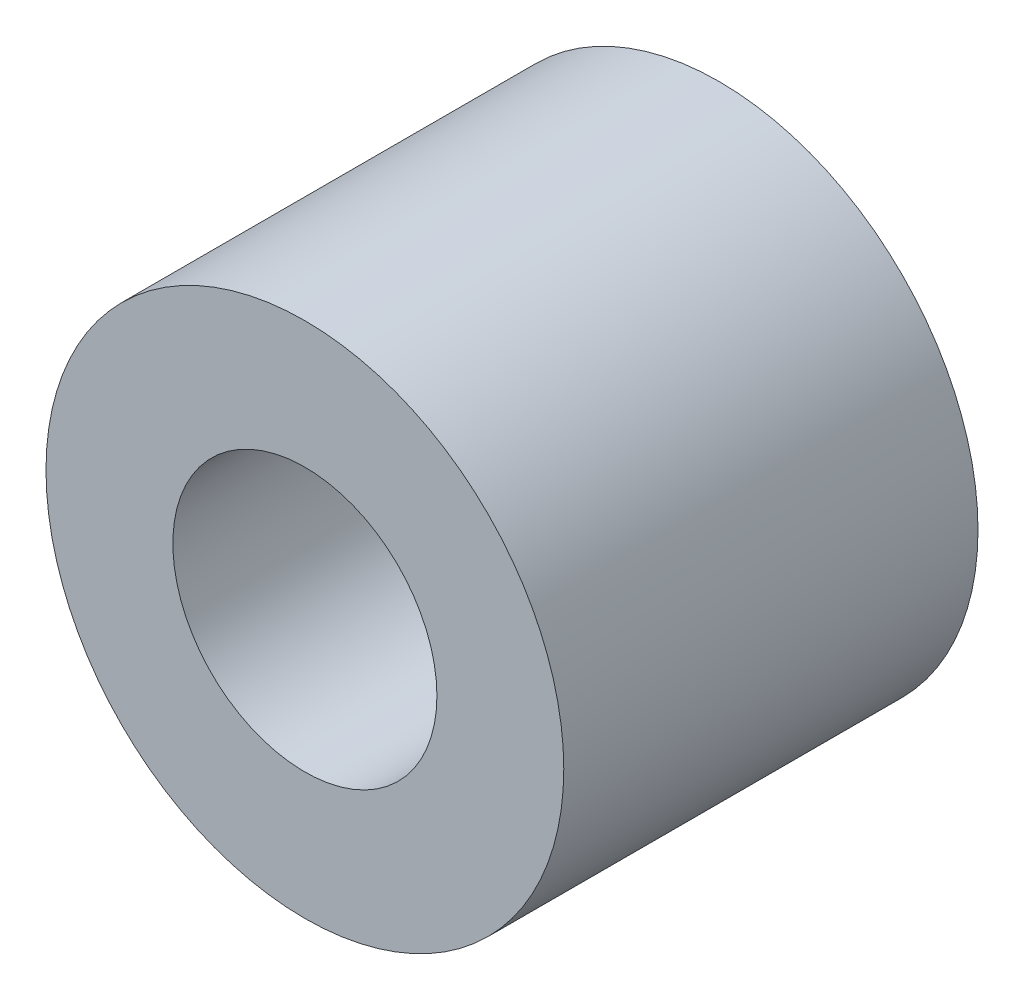
ISO-10303-21;
HEADER;
FILE_DESCRIPTION(('STEP AP214'),'2;1');
FILE_NAME('part.step','',(''),(''),'','','');
FILE_SCHEMA(('AUTOMOTIVE_DESIGN { 1 0 10303 214 1 1 1 1 }'));
ENDSEC;
DATA;
#1=APPLICATION_CONTEXT('core data for automotive mechanical design processes');
#2=APPLICATION_PROTOCOL_DEFINITION('international standard','automotive_design',2000,#1);
#3=PRODUCT_CONTEXT('',#1,'mechanical');
#4=PRODUCT('Part','Part','',(#3));
#5=PRODUCT_RELATED_PRODUCT_CATEGORY('part','',(#4));
#6=PRODUCT_DEFINITION_FORMATION('','',#4);
#7=PRODUCT_DEFINITION_CONTEXT('part definition',#1,'design');
#8=PRODUCT_DEFINITION('design','',#6,#7);
#9=PRODUCT_DEFINITION_SHAPE('','',#8);
#10=(LENGTH_UNIT() NAMED_UNIT(*) SI_UNIT(.MILLI.,.METRE.));
#11=(NAMED_UNIT(*) PLANE_ANGLE_UNIT() SI_UNIT($,.RADIAN.));
#12=(NAMED_UNIT(*) SI_UNIT($,.STERADIAN.) SOLID_ANGLE_UNIT());
#13=UNCERTAINTY_MEASURE_WITH_UNIT(LENGTH_MEASURE(1.E-05),#10,'distance_accuracy_value','');
#14=(GEOMETRIC_REPRESENTATION_CONTEXT(3) GLOBAL_UNCERTAINTY_ASSIGNED_CONTEXT((#13)) GLOBAL_UNIT_ASSIGNED_CONTEXT((#10,
#11,#12)) REPRESENTATION_CONTEXT('',''));
#15=CARTESIAN_POINT('',(0.,0.,0.));
#16=DIRECTION('',(0.,0.,1.));
#17=DIRECTION('',(1.,0.,0.));
#18=AXIS2_PLACEMENT_3D('',#15,#16,#17);
#19=CARTESIAN_POINT('',(-10.,0.,8.));
#20=DIRECTION('',(0.,0.,-1.));
#21=DIRECTION('',(-1.,0.,0.));
#22=AXIS2_PLACEMENT_3D('',#19,#20,#21);
#23=PLANE('',#22);
#24=CARTESIAN_POINT('',(0.,0.,8.));
#25=DIRECTION('',(0.,0.,1.));
#26=DIRECTION('',(1.,0.,0.));
#27=AXIS2_PLACEMENT_3D('',#24,#25,#26);
#28=CIRCLE('',#27,5.1);
#29=CARTESIAN_POINT('',(5.1,0.,8.));
#30=VERTEX_POINT('',#29);
#31=EDGE_CURVE('E51',#30,#30,#28,.T.);
#32=ORIENTED_EDGE('',*,*,#31,.F.);
#33=EDGE_LOOP('',(#32));
#34=FACE_BOUND('',#33,.T.);
#35=CARTESIAN_POINT('',(0.,0.,8.));
#36=DIRECTION('',(0.,0.,1.));
#37=DIRECTION('',(1.,0.,0.));
#38=AXIS2_PLACEMENT_3D('',#35,#36,#37);
#39=CIRCLE('',#38,10.);
#40=CARTESIAN_POINT('',(10.,0.,8.));
#41=VERTEX_POINT('',#40);
#42=EDGE_CURVE('E43',#41,#41,#39,.T.);
#43=ORIENTED_EDGE('',*,*,#42,.T.);
#44=EDGE_LOOP('',(#43));
#45=FACE_BOUND('',#44,.T.);
#46=ADVANCED_FACE('F37',(#34,#45),#23,.F.);
#47=CARTESIAN_POINT('',(-10.,0.,-8.));
#48=DIRECTION('',(0.,0.,1.));
#49=DIRECTION('',(1.,0.,0.));
#50=AXIS2_PLACEMENT_3D('',#47,#48,#49);
#51=PLANE('',#50);
#52=CARTESIAN_POINT('',(0.,0.,-8.));
#53=DIRECTION('',(0.,0.,1.));
#54=DIRECTION('',(1.,0.,0.));
#55=AXIS2_PLACEMENT_3D('',#52,#53,#54);
#56=CIRCLE('',#55,5.1);
#57=CARTESIAN_POINT('',(5.1,0.,-8.));
#58=VERTEX_POINT('',#57);
#59=EDGE_CURVE('E47',#58,#58,#56,.T.);
#60=ORIENTED_EDGE('',*,*,#59,.T.);
#61=EDGE_LOOP('',(#60));
#62=FACE_BOUND('',#61,.T.);
#63=CARTESIAN_POINT('',(0.,0.,-8.));
#64=DIRECTION('',(0.,0.,1.));
#65=DIRECTION('',(1.,0.,0.));
#66=AXIS2_PLACEMENT_3D('',#63,#64,#65);
#67=CIRCLE('',#66,10.);
#68=CARTESIAN_POINT('',(10.,0.,-8.));
#69=VERTEX_POINT('',#68);
#70=EDGE_CURVE('E10',#69,#69,#67,.T.);
#71=ORIENTED_EDGE('',*,*,#70,.F.);
#72=EDGE_LOOP('',(#71));
#73=FACE_BOUND('',#72,.T.);
#74=ADVANCED_FACE('F60',(#62,#73),#51,.F.);
#75=CARTESIAN_POINT('',(0.,0.,8.));
#76=DIRECTION('',(0.,0.,1.));
#77=DIRECTION('',(1.,0.,0.));
#78=AXIS2_PLACEMENT_3D('',#75,#76,#77);
#79=CYLINDRICAL_SURFACE('',#78,10.);
#80=ORIENTED_EDGE('',*,*,#42,.F.);
#81=EDGE_LOOP('',(#80));
#82=FACE_BOUND('',#81,.T.);
#83=ORIENTED_EDGE('',*,*,#70,.T.);
#84=EDGE_LOOP('',(#83));
#85=FACE_BOUND('',#84,.T.);
#86=ADVANCED_FACE('F65',(#82,#85),#79,.T.);
#87=CARTESIAN_POINT('',(0.,0.,-8.));
#88=DIRECTION('',(0.,0.,1.));
#89=DIRECTION('',(1.,0.,0.));
#90=AXIS2_PLACEMENT_3D('',#87,#88,#89);
#91=CYLINDRICAL_SURFACE('',#90,5.1);
#92=ORIENTED_EDGE('',*,*,#59,.F.);
#93=EDGE_LOOP('',(#92));
#94=FACE_BOUND('',#93,.T.);
#95=ORIENTED_EDGE('',*,*,#31,.T.);
#96=EDGE_LOOP('',(#95));
#97=FACE_BOUND('',#96,.T.);
#98=ADVANCED_FACE('F57',(#94,#97),#91,.F.);
#99=CLOSED_SHELL('',(#46,#74,#86,#98));
#100=MANIFOLD_SOLID_BREP('B2',#99);
#101=ADVANCED_BREP_SHAPE_REPRESENTATION('',(#18,#100),#14);
#102=SHAPE_DEFINITION_REPRESENTATION(#9,#101);
ENDSEC;
END-ISO-10303-21;
